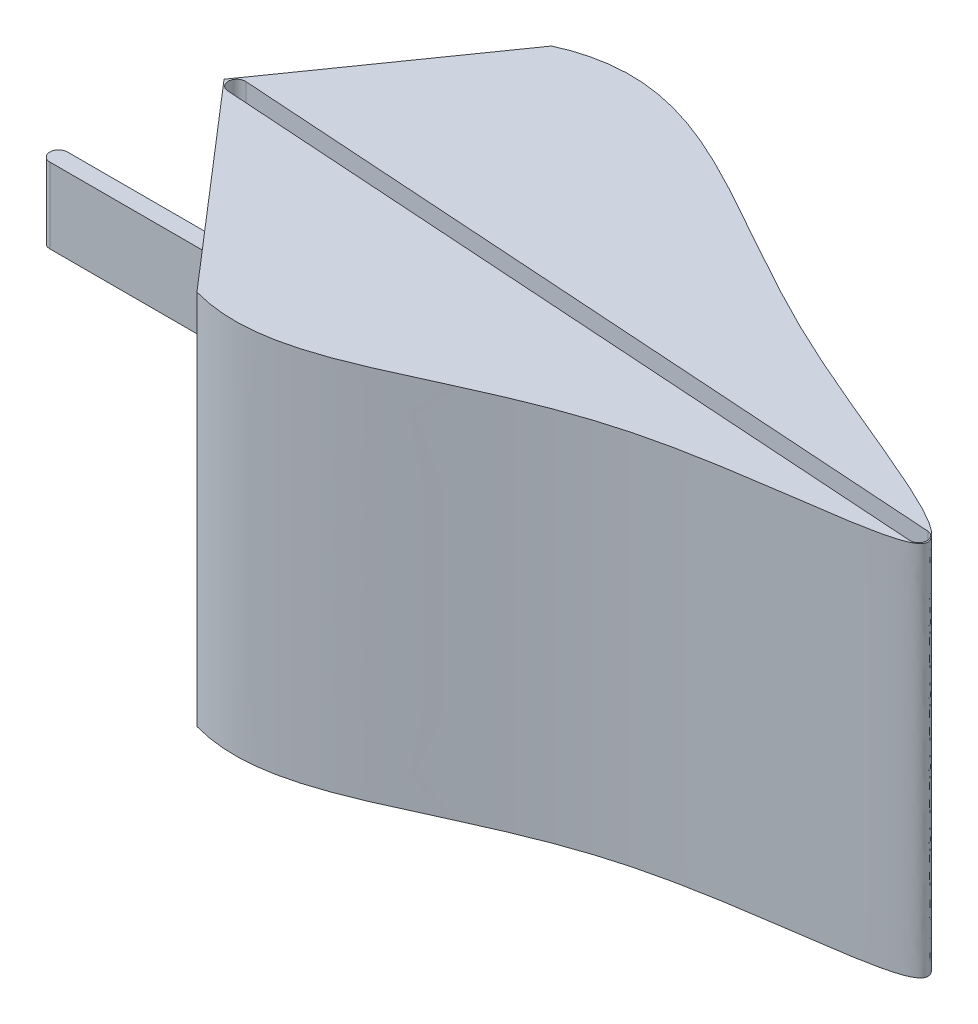
ISO-10303-21;
HEADER;
FILE_DESCRIPTION(('STEP AP214'),'2;1');
FILE_NAME('part.step','',(''),(''),'','','');
FILE_SCHEMA(('AUTOMOTIVE_DESIGN { 1 0 10303 214 1 1 1 1 }'));
ENDSEC;
DATA;
#1=APPLICATION_CONTEXT('core data for automotive mechanical design processes');
#2=APPLICATION_PROTOCOL_DEFINITION('international standard','automotive_design',2000,#1);
#3=PRODUCT_CONTEXT('',#1,'mechanical');
#4=PRODUCT('Part','Part','',(#3));
#5=PRODUCT_RELATED_PRODUCT_CATEGORY('part','',(#4));
#6=PRODUCT_DEFINITION_FORMATION('','',#4);
#7=PRODUCT_DEFINITION_CONTEXT('part definition',#1,'design');
#8=PRODUCT_DEFINITION('design','',#6,#7);
#9=PRODUCT_DEFINITION_SHAPE('','',#8);
#10=(LENGTH_UNIT() NAMED_UNIT(*) SI_UNIT(.MILLI.,.METRE.));
#11=(NAMED_UNIT(*) PLANE_ANGLE_UNIT() SI_UNIT($,.RADIAN.));
#12=(NAMED_UNIT(*) SI_UNIT($,.STERADIAN.) SOLID_ANGLE_UNIT());
#13=UNCERTAINTY_MEASURE_WITH_UNIT(LENGTH_MEASURE(1.E-05),#10,'distance_accuracy_value','');
#14=(GEOMETRIC_REPRESENTATION_CONTEXT(3) GLOBAL_UNCERTAINTY_ASSIGNED_CONTEXT((#13)) GLOBAL_UNIT_ASSIGNED_CONTEXT((#10,
#11,#12)) REPRESENTATION_CONTEXT('',''));
#15=CARTESIAN_POINT('',(0.,0.,0.));
#16=DIRECTION('',(0.,0.,1.));
#17=DIRECTION('',(1.,0.,0.));
#18=AXIS2_PLACEMENT_3D('',#15,#16,#17);
#19=CARTESIAN_POINT('',(-1.70762932432973,5.,-1.1973974284757));
#20=DIRECTION('',(0.818768320712917,0.,0.574124060632325));
#21=DIRECTION('',(0.574124060632325,0.,-0.818768320712917));
#22=AXIS2_PLACEMENT_3D('',#19,#20,#21);
#23=PLANE('',#22);
#24=DIRECTION('',(-0.574124060632325,0.,0.818768320712917));
#25=VECTOR('',#24,1.);
#26=CARTESIAN_POINT('',(-1.70762932432973,2.,-1.1973974284757));
#27=LINE('',#26,#25);
#28=CARTESIAN_POINT('',(-2.9660266568039,2.,0.597224921203759));
#29=VERTEX_POINT('',#28);
#30=CARTESIAN_POINT('',(-3.05038548425136,2.,0.717530514058368));
#31=VERTEX_POINT('',#30);
#32=EDGE_CURVE('E62',#29,#31,#27,.T.);
#33=ORIENTED_EDGE('',*,*,#32,.F.);
#34=DIRECTION('',(0.,1.,0.));
#35=VECTOR('',#34,1.);
#36=CARTESIAN_POINT('',(-2.9660266568039,2.,0.597224921203759));
#37=LINE('',#36,#35);
#38=CARTESIAN_POINT('',(-2.9660266568039,3.,0.597224921203758));
#39=VERTEX_POINT('',#38);
#40=EDGE_CURVE('E66',#29,#39,#37,.T.);
#41=ORIENTED_EDGE('',*,*,#40,.T.);
#42=DIRECTION('',(-0.574124060632325,0.,0.818768320712917));
#43=VECTOR('',#42,1.);
#44=CARTESIAN_POINT('',(-1.70762932432973,3.,-1.1973974284757));
#45=LINE('',#44,#43);
#46=CARTESIAN_POINT('',(-3.05038548425136,3.,0.717530514058368));
#47=VERTEX_POINT('',#46);
#48=EDGE_CURVE('E155',#39,#47,#45,.T.);
#49=ORIENTED_EDGE('',*,*,#48,.T.);
#50=DIRECTION('',(0.,-1.,0.));
#51=VECTOR('',#50,1.);
#52=CARTESIAN_POINT('',(-3.05038548425136,5.,0.717530514058368));
#53=LINE('',#52,#51);
#54=CARTESIAN_POINT('',(-3.05038548425136,5.,0.717530514058368));
#55=VERTEX_POINT('',#54);
#56=EDGE_CURVE('E294',#55,#47,#53,.T.);
#57=ORIENTED_EDGE('',*,*,#56,.F.);
#58=DIRECTION('',(-0.574124060632325,0.,0.818768320712917));
#59=VECTOR('',#58,1.);
#60=CARTESIAN_POINT('',(-1.70762932432973,5.,-1.1973974284757));
#61=LINE('',#60,#59);
#62=CARTESIAN_POINT('',(-1.25603944900907,5.,-1.84141761369493));
#63=VERTEX_POINT('',#62);
#64=EDGE_CURVE('E264',#63,#55,#61,.T.);
#65=ORIENTED_EDGE('',*,*,#64,.F.);
#66=DIRECTION('',(0.,-1.,0.));
#67=VECTOR('',#66,1.);
#68=CARTESIAN_POINT('',(-1.25603944900907,5.,-1.84141761369493));
#69=LINE('',#68,#67);
#70=CARTESIAN_POINT('',(-1.25603944900907,0.,-1.84141761369493));
#71=VERTEX_POINT('',#70);
#72=EDGE_CURVE('E297',#63,#71,#69,.T.);
#73=ORIENTED_EDGE('',*,*,#72,.T.);
#74=DIRECTION('',(-0.574124060632325,0.,0.818768320712917));
#75=VECTOR('',#74,1.);
#76=CARTESIAN_POINT('',(-1.70762932432973,0.,-1.1973974284757));
#77=LINE('',#76,#75);
#78=CARTESIAN_POINT('',(-3.05038548425136,0.,0.717530514058368));
#79=VERTEX_POINT('',#78);
#80=EDGE_CURVE('E281',#71,#79,#77,.T.);
#81=ORIENTED_EDGE('',*,*,#80,.T.);
#82=EDGE_CURVE('E293',#31,#79,#53,.T.);
#83=ORIENTED_EDGE('',*,*,#82,.F.);
#84=EDGE_LOOP('',(#33,#41,#49,#57,#65,#73,#81,#83));
#85=FACE_BOUND('',#84,.T.);
#86=ADVANCED_FACE('F45',(#85),#23,.F.);
#87=CARTESIAN_POINT('',(-2.10344880235215,5.,1.81497449305794));
#88=DIRECTION('',(-0.757115007215496,0.,0.653281612973364));
#89=DIRECTION('',(0.653281612973364,0.,0.757115007215496));
#90=AXIS2_PLACEMENT_3D('',#87,#88,#89);
#91=PLANE('',#90);
#92=DIRECTION('',(0.,1.,0.));
#93=VECTOR('',#92,1.);
#94=CARTESIAN_POINT('',(-2.95774852078591,2.,0.824891312020131));
#95=LINE('',#94,#93);
#96=CARTESIAN_POINT('',(-2.95774852078591,2.,0.824891312020131));
#97=VERTEX_POINT('',#96);
#98=CARTESIAN_POINT('',(-2.95774852078591,3.,0.824891312020131));
#99=VERTEX_POINT('',#98);
#100=EDGE_CURVE('E55',#97,#99,#95,.T.);
#101=ORIENTED_EDGE('',*,*,#100,.F.);
#102=DIRECTION('',(-0.653281612973364,0.,-0.757115007215496));
#103=VECTOR('',#102,1.);
#104=CARTESIAN_POINT('',(-2.10344880235215,2.,1.81497449305794));
#105=LINE('',#104,#103);
#106=EDGE_CURVE('E11',#97,#31,#105,.T.);
#107=ORIENTED_EDGE('',*,*,#106,.T.);
#108=ORIENTED_EDGE('',*,*,#82,.T.);
#109=DIRECTION('',(-0.653281612973364,0.,-0.757115007215496));
#110=VECTOR('',#109,1.);
#111=CARTESIAN_POINT('',(-2.10344880235215,0.,1.81497449305794));
#112=LINE('',#111,#110);
#113=CARTESIAN_POINT('',(-0.780587172944463,0.,3.34809339952092));
#114=VERTEX_POINT('',#113);
#115=EDGE_CURVE('E265',#114,#79,#112,.T.);
#116=ORIENTED_EDGE('',*,*,#115,.F.);
#117=DIRECTION('',(0.,-1.,0.));
#118=VECTOR('',#117,1.);
#119=CARTESIAN_POINT('',(-0.780587172944463,5.,3.34809339952092));
#120=LINE('',#119,#118);
#121=CARTESIAN_POINT('',(-0.780587172944463,5.,3.34809339952092));
#122=VERTEX_POINT('',#121);
#123=EDGE_CURVE('E275',#122,#114,#120,.T.);
#124=ORIENTED_EDGE('',*,*,#123,.F.);
#125=DIRECTION('',(-0.653281612973364,0.,-0.757115007215496));
#126=VECTOR('',#125,1.);
#127=CARTESIAN_POINT('',(-2.10344880235215,5.,1.81497449305794));
#128=LINE('',#127,#126);
#129=EDGE_CURVE('E271',#122,#55,#128,.T.);
#130=ORIENTED_EDGE('',*,*,#129,.T.);
#131=ORIENTED_EDGE('',*,*,#56,.T.);
#132=DIRECTION('',(-0.653281612973364,0.,-0.757115007215496));
#133=VECTOR('',#132,1.);
#134=CARTESIAN_POINT('',(-2.10344880235215,3.,1.81497449305794));
#135=LINE('',#134,#133);
#136=EDGE_CURVE('E300',#99,#47,#135,.T.);
#137=ORIENTED_EDGE('',*,*,#136,.F.);
#138=EDGE_LOOP('',(#101,#107,#108,#116,#124,#130,#131,#137));
#139=FACE_BOUND('',#138,.T.);
#140=ADVANCED_FACE('F317',(#139),#91,.T.);
#141=CARTESIAN_POINT('',(-3.05038548425136,5.,0.717530514058367));
#142=CARTESIAN_POINT('',(-3.07042978102789,5.,-0.348101200576227));
#143=CARTESIAN_POINT('',(-0.570904340301446,5.,-3.27934040407769));
#144=CARTESIAN_POINT('',(2.51061874756297,5.,-0.367707339944473));
#145=CARTESIAN_POINT('',(8.76491562461771,5.,1.63544852523869));
#146=CARTESIAN_POINT('',(2.58465033811313,5.,1.77274229454659));
#147=CARTESIAN_POINT('',(-0.229785259933754,5.,4.59680119752773));
#148=CARTESIAN_POINT('',(-3.02810230230291,5.,1.90218995369812));
#149=CARTESIAN_POINT('',(-3.05038548425136,5.,0.717530514058367));
#150=B_SPLINE_CURVE_WITH_KNOTS('',3,(#141,#142,#143,#144,#145,#146,#147,#148,#149),
.UNSPECIFIED.,.T.,.F.,(4,1,1,1,1,1,4),(0.,0.133444496933957,0.358406605125516,0.511014145272804,
0.653251299475649,0.8516501707018,1.),.UNSPECIFIED.);
#151=DIRECTION('',(0.,-1.,0.));
#152=VECTOR('',#151,1.);
#153=SURFACE_OF_LINEAR_EXTRUSION('',#150,#152);
#154=CARTESIAN_POINT('',(-3.05038548425136,0.,0.717530514058367));
#155=CARTESIAN_POINT('',(-3.07042978102789,0.,-0.348101200576227));
#156=CARTESIAN_POINT('',(-0.570904340301446,0.,-3.27934040407769));
#157=CARTESIAN_POINT('',(2.51061874756297,0.,-0.367707339944473));
#158=CARTESIAN_POINT('',(8.76491562461771,0.,1.63544852523869));
#159=CARTESIAN_POINT('',(2.58465033811313,0.,1.77274229454659));
#160=CARTESIAN_POINT('',(-0.229785259933754,0.,4.59680119752773));
#161=CARTESIAN_POINT('',(-3.02810230230291,0.,1.90218995369812));
#162=CARTESIAN_POINT('',(-3.05038548425136,0.,0.717530514058367));
#163=B_SPLINE_CURVE_WITH_KNOTS('',3,(#154,#155,#156,#157,#158,#159,#160,#161,#162),
.UNSPECIFIED.,.T.,.F.,(4,1,1,1,1,1,4),(0.,0.133444496933957,0.358406605125516,0.511014145272804,
0.653251299475649,0.8516501707018,1.),.UNSPECIFIED.);
#164=EDGE_CURVE('E248',#71,#114,#163,.T.);
#165=ORIENTED_EDGE('',*,*,#164,.F.);
#166=ORIENTED_EDGE('',*,*,#72,.F.);
#167=EDGE_CURVE('E257',#63,#122,#150,.T.);
#168=ORIENTED_EDGE('',*,*,#167,.T.);
#169=ORIENTED_EDGE('',*,*,#123,.T.);
#170=EDGE_LOOP('',(#165,#166,#168,#169));
#171=FACE_BOUND('',#170,.T.);
#172=ADVANCED_FACE('F47',(#171),#153,.T.);
#173=CARTESIAN_POINT('',(0.,5.,0.));
#174=DIRECTION('',(0.,1.,0.));
#175=DIRECTION('',(0.,0.,1.));
#176=AXIS2_PLACEMENT_3D('',#173,#174,#175);
#177=PLANE('',#176);
#178=CARTESIAN_POINT('',(-2.88540033392337,5.,0.713066641255367));
#179=DIRECTION('',(0.,1.,0.));
#180=DIRECTION('',(0.,0.,1.));
#181=AXIS2_PLACEMENT_3D('',#178,#179,#180);
#182=CIRCLE('',#181,0.11394124930811);
#183=CARTESIAN_POINT('',(-2.87787149697776,5.,0.599374403577769));
#184=VERTEX_POINT('',#183);
#185=CARTESIAN_POINT('',(-2.89292917086898,5.,0.826758878932964));
#186=VERTEX_POINT('',#185);
#187=EDGE_CURVE('E213',#184,#186,#182,.T.);
#188=ORIENTED_EDGE('',*,*,#187,.F.);
#189=DIRECTION('',(-0.997814561170563,0.,-0.066076482321608));
#190=VECTOR('',#189,1.);
#191=CARTESIAN_POINT('',(-2.87787149697776,5.,0.599374403577769));
#192=LINE('',#191,#190);
#193=CARTESIAN_POINT('',(6.82681995873197,5.,1.24203076314983));
#194=VERTEX_POINT('',#193);
#195=EDGE_CURVE('E219',#194,#184,#192,.T.);
#196=ORIENTED_EDGE('',*,*,#195,.F.);
#197=CARTESIAN_POINT('',(6.81929112178636,5.,1.35572300082742));
#198=DIRECTION('',(0.,1.,0.));
#199=DIRECTION('',(0.,0.,1.));
#200=AXIS2_PLACEMENT_3D('',#197,#198,#199);
#201=CIRCLE('',#200,0.11394124930811);
#202=CARTESIAN_POINT('',(6.81176228484075,5.,1.46941523850502));
#203=VERTEX_POINT('',#202);
#204=EDGE_CURVE('E238',#203,#194,#201,.T.);
#205=ORIENTED_EDGE('',*,*,#204,.F.);
#206=DIRECTION('',(0.997814561170563,0.,0.066076482321608));
#207=VECTOR('',#206,1.);
#208=CARTESIAN_POINT('',(-2.89292917086898,5.,0.826758878932964));
#209=LINE('',#208,#207);
#210=EDGE_CURVE('E234',#186,#203,#209,.T.);
#211=ORIENTED_EDGE('',*,*,#210,.F.);
#212=EDGE_LOOP('',(#188,#196,#205,#211));
#213=FACE_BOUND('',#212,.T.);
#214=ORIENTED_EDGE('',*,*,#167,.F.);
#215=ORIENTED_EDGE('',*,*,#64,.T.);
#216=ORIENTED_EDGE('',*,*,#129,.F.);
#217=EDGE_LOOP('',(#214,#215,#216));
#218=FACE_BOUND('',#217,.T.);
#219=ADVANCED_FACE('F330',(#213,#218),#177,.T.);
#220=CARTESIAN_POINT('',(0.,0.,0.));
#221=DIRECTION('',(0.,1.,0.));
#222=DIRECTION('',(0.,0.,1.));
#223=AXIS2_PLACEMENT_3D('',#220,#221,#222);
#224=PLANE('',#223);
#225=ORIENTED_EDGE('',*,*,#164,.T.);
#226=ORIENTED_EDGE('',*,*,#115,.T.);
#227=ORIENTED_EDGE('',*,*,#80,.F.);
#228=EDGE_LOOP('',(#225,#226,#227));
#229=FACE_BOUND('',#228,.T.);
#230=ADVANCED_FACE('F325',(#229),#224,.F.);
#231=CARTESIAN_POINT('',(-2.88540033392337,4.,0.713066641255367));
#232=DIRECTION('',(0.,1.,0.));
#233=DIRECTION('',(0.,0.,1.));
#234=AXIS2_PLACEMENT_3D('',#231,#232,#233);
#235=CYLINDRICAL_SURFACE('',#234,0.11394124930811);
#236=ORIENTED_EDGE('',*,*,#187,.T.);
#237=DIRECTION('',(0.,1.,0.));
#238=VECTOR('',#237,1.);
#239=CARTESIAN_POINT('',(-2.89292917086898,4.,0.826758878932964));
#240=LINE('',#239,#238);
#241=CARTESIAN_POINT('',(-2.89292917086898,4.,0.826758878932964));
#242=VERTEX_POINT('',#241);
#243=EDGE_CURVE('E231',#242,#186,#240,.T.);
#244=ORIENTED_EDGE('',*,*,#243,.F.);
#245=CARTESIAN_POINT('',(-2.88540033392337,4.,0.713066641255367));
#246=DIRECTION('',(0.,1.,0.));
#247=DIRECTION('',(0.,0.,1.));
#248=AXIS2_PLACEMENT_3D('',#245,#246,#247);
#249=CIRCLE('',#248,0.11394124930811);
#250=CARTESIAN_POINT('',(-2.87787149697776,4.,0.599374403577769));
#251=VERTEX_POINT('',#250);
#252=EDGE_CURVE('E214',#251,#242,#249,.T.);
#253=ORIENTED_EDGE('',*,*,#252,.F.);
#254=DIRECTION('',(0.,1.,0.));
#255=VECTOR('',#254,1.);
#256=CARTESIAN_POINT('',(-2.87787149697776,4.,0.599374403577769));
#257=LINE('',#256,#255);
#258=EDGE_CURVE('E245',#251,#184,#257,.T.);
#259=ORIENTED_EDGE('',*,*,#258,.T.);
#260=EDGE_LOOP('',(#236,#244,#253,#259));
#261=FACE_BOUND('',#260,.T.);
#262=ADVANCED_FACE('F340',(#261),#235,.F.);
#263=CARTESIAN_POINT('',(-2.87787149697776,4.,0.599374403577769));
#264=DIRECTION('',(0.066076482321608,0.,-0.997814561170563));
#265=DIRECTION('',(-0.997814561170563,0.,-0.066076482321608));
#266=AXIS2_PLACEMENT_3D('',#263,#264,#265);
#267=PLANE('',#266);
#268=ORIENTED_EDGE('',*,*,#195,.T.);
#269=ORIENTED_EDGE('',*,*,#258,.F.);
#270=DIRECTION('',(-0.997814561170563,0.,-0.066076482321608));
#271=VECTOR('',#270,1.);
#272=CARTESIAN_POINT('',(-2.87787149697776,4.,0.599374403577769));
#273=LINE('',#272,#271);
#274=CARTESIAN_POINT('',(6.82681995873197,4.,1.24203076314983));
#275=VERTEX_POINT('',#274);
#276=EDGE_CURVE('E227',#275,#251,#273,.T.);
#277=ORIENTED_EDGE('',*,*,#276,.F.);
#278=DIRECTION('',(0.,1.,0.));
#279=VECTOR('',#278,1.);
#280=CARTESIAN_POINT('',(6.82681995873197,4.,1.24203076314983));
#281=LINE('',#280,#279);
#282=EDGE_CURVE('E249',#275,#194,#281,.T.);
#283=ORIENTED_EDGE('',*,*,#282,.T.);
#284=EDGE_LOOP('',(#268,#269,#277,#283));
#285=FACE_BOUND('',#284,.T.);
#286=ADVANCED_FACE('F420',(#285),#267,.F.);
#287=CARTESIAN_POINT('',(6.81929112178636,4.,1.35572300082742));
#288=DIRECTION('',(0.,1.,0.));
#289=DIRECTION('',(0.,0.,1.));
#290=AXIS2_PLACEMENT_3D('',#287,#288,#289);
#291=CYLINDRICAL_SURFACE('',#290,0.11394124930811);
#292=ORIENTED_EDGE('',*,*,#204,.T.);
#293=ORIENTED_EDGE('',*,*,#282,.F.);
#294=CARTESIAN_POINT('',(6.81929112178636,4.,1.35572300082742));
#295=DIRECTION('',(0.,1.,0.));
#296=DIRECTION('',(0.,0.,1.));
#297=AXIS2_PLACEMENT_3D('',#294,#295,#296);
#298=CIRCLE('',#297,0.11394124930811);
#299=CARTESIAN_POINT('',(6.81176228484075,4.,1.46941523850502));
#300=VERTEX_POINT('',#299);
#301=EDGE_CURVE('E223',#300,#275,#298,.T.);
#302=ORIENTED_EDGE('',*,*,#301,.F.);
#303=DIRECTION('',(0.,1.,0.));
#304=VECTOR('',#303,1.);
#305=CARTESIAN_POINT('',(6.81176228484075,4.,1.46941523850502));
#306=LINE('',#305,#304);
#307=EDGE_CURVE('E252',#300,#203,#306,.T.);
#308=ORIENTED_EDGE('',*,*,#307,.T.);
#309=EDGE_LOOP('',(#292,#293,#302,#308));
#310=FACE_BOUND('',#309,.T.);
#311=ADVANCED_FACE('F423',(#310),#291,.F.);
#312=CARTESIAN_POINT('',(-2.89292917086898,4.,0.826758878932964));
#313=DIRECTION('',(-0.066076482321608,0.,0.997814561170563));
#314=DIRECTION('',(0.997814561170563,0.,0.066076482321608));
#315=AXIS2_PLACEMENT_3D('',#312,#313,#314);
#316=PLANE('',#315);
#317=ORIENTED_EDGE('',*,*,#210,.T.);
#318=ORIENTED_EDGE('',*,*,#307,.F.);
#319=DIRECTION('',(0.997814561170563,0.,0.066076482321608));
#320=VECTOR('',#319,1.);
#321=CARTESIAN_POINT('',(-2.89292917086898,4.,0.826758878932964));
#322=LINE('',#321,#320);
#323=EDGE_CURVE('E218',#242,#300,#322,.T.);
#324=ORIENTED_EDGE('',*,*,#323,.F.);
#325=ORIENTED_EDGE('',*,*,#243,.T.);
#326=EDGE_LOOP('',(#317,#318,#324,#325));
#327=FACE_BOUND('',#326,.T.);
#328=ADVANCED_FACE('F418',(#327),#316,.F.);
#329=CARTESIAN_POINT('',(-2.88540033392337,4.,0.713066641255367));
#330=DIRECTION('',(0.,1.,0.));
#331=DIRECTION('',(0.,0.,1.));
#332=AXIS2_PLACEMENT_3D('',#329,#330,#331);
#333=PLANE('',#332);
#334=ORIENTED_EDGE('',*,*,#252,.T.);
#335=ORIENTED_EDGE('',*,*,#323,.T.);
#336=ORIENTED_EDGE('',*,*,#301,.T.);
#337=ORIENTED_EDGE('',*,*,#276,.T.);
#338=EDGE_LOOP('',(#334,#335,#336,#337));
#339=FACE_BOUND('',#338,.T.);
#340=ADVANCED_FACE('F362',(#339),#333,.T.);
#341=CARTESIAN_POINT('',(-2.98581680207407,2.,0.711928202361616));
#342=DIRECTION('',(0.,1.,0.));
#343=DIRECTION('',(0.,0.,1.));
#344=AXIS2_PLACEMENT_3D('',#341,#342,#343);
#345=CYLINDRICAL_SURFACE('',#344,0.116397992071138);
#346=ORIENTED_EDGE('',*,*,#40,.F.);
#347=CARTESIAN_POINT('',(-2.98581680207407,2.,0.711928202361616));
#348=DIRECTION('',(0.,1.,0.));
#349=DIRECTION('',(0.,0.,1.));
#350=AXIS2_PLACEMENT_3D('',#347,#348,#349);
#351=CIRCLE('',#350,0.116397992071138);
#352=CARTESIAN_POINT('',(-2.98581680207407,2.,0.595530210290478));
#353=VERTEX_POINT('',#352);
#354=EDGE_CURVE('E164',#29,#353,#351,.T.);
#355=ORIENTED_EDGE('',*,*,#354,.T.);
#356=DIRECTION('',(0.,1.,0.));
#357=VECTOR('',#356,1.);
#358=CARTESIAN_POINT('',(-2.98581680207407,2.,0.595530210290478));
#359=LINE('',#358,#357);
#360=CARTESIAN_POINT('',(-2.98581680207407,3.,0.595530210290478));
#361=VERTEX_POINT('',#360);
#362=EDGE_CURVE('E161',#353,#361,#359,.T.);
#363=ORIENTED_EDGE('',*,*,#362,.T.);
#364=CARTESIAN_POINT('',(-2.98581680207407,3.,0.711928202361616));
#365=DIRECTION('',(0.,1.,0.));
#366=DIRECTION('',(0.,0.,1.));
#367=AXIS2_PLACEMENT_3D('',#364,#365,#366);
#368=CIRCLE('',#367,0.116397992071138);
#369=EDGE_CURVE('E147',#39,#361,#368,.T.);
#370=ORIENTED_EDGE('',*,*,#369,.F.);
#371=EDGE_LOOP('',(#346,#355,#363,#370));
#372=FACE_BOUND('',#371,.T.);
#373=ADVANCED_FACE('F162',(#372),#345,.T.);
#374=CARTESIAN_POINT('',(-2.98581680207407,2.,0.711928202361616));
#375=DIRECTION('',(0.,1.,0.));
#376=DIRECTION('',(0.,0.,1.));
#377=AXIS2_PLACEMENT_3D('',#374,#375,#376);
#378=PLANE('',#377);
#379=ORIENTED_EDGE('',*,*,#354,.F.);
#380=ORIENTED_EDGE('',*,*,#32,.T.);
#381=ORIENTED_EDGE('',*,*,#106,.F.);
#382=CARTESIAN_POINT('',(-2.98581680207407,2.,0.828326194432754));
#383=VERTEX_POINT('',#382);
#384=EDGE_CURVE('E185',#383,#97,#351,.T.);
#385=ORIENTED_EDGE('',*,*,#384,.F.);
#386=DIRECTION('',(1.,0.,0.));
#387=VECTOR('',#386,1.);
#388=CARTESIAN_POINT('',(-2.98581680207407,2.,0.828326194432754));
#389=LINE('',#388,#387);
#390=CARTESIAN_POINT('',(-5.25428433643824,2.,0.828326194432754));
#391=VERTEX_POINT('',#390);
#392=EDGE_CURVE('E170',#391,#383,#389,.T.);
#393=ORIENTED_EDGE('',*,*,#392,.F.);
#394=CARTESIAN_POINT('',(-5.25428433643824,2.,0.711928202361616));
#395=DIRECTION('',(0.,1.,0.));
#396=DIRECTION('',(0.,0.,1.));
#397=AXIS2_PLACEMENT_3D('',#394,#395,#396);
#398=CIRCLE('',#397,0.116397992071138);
#399=CARTESIAN_POINT('',(-5.25428433643824,2.,0.595530210290478));
#400=VERTEX_POINT('',#399);
#401=EDGE_CURVE('E192',#400,#391,#398,.T.);
#402=ORIENTED_EDGE('',*,*,#401,.F.);
#403=DIRECTION('',(-1.,0.,0.));
#404=VECTOR('',#403,1.);
#405=CARTESIAN_POINT('',(-2.98581680207407,2.,0.595530210290478));
#406=LINE('',#405,#404);
#407=EDGE_CURVE('E189',#353,#400,#406,.T.);
#408=ORIENTED_EDGE('',*,*,#407,.F.);
#409=EDGE_LOOP('',(#379,#380,#381,#385,#393,#402,#408));
#410=FACE_BOUND('',#409,.T.);
#411=ADVANCED_FACE('F315',(#410),#378,.F.);
#412=CARTESIAN_POINT('',(-2.98581680207407,3.,0.711928202361616));
#413=DIRECTION('',(0.,1.,0.));
#414=DIRECTION('',(0.,0.,1.));
#415=AXIS2_PLACEMENT_3D('',#412,#413,#414);
#416=PLANE('',#415);
#417=ORIENTED_EDGE('',*,*,#48,.F.);
#418=ORIENTED_EDGE('',*,*,#369,.T.);
#419=DIRECTION('',(-1.,0.,0.));
#420=VECTOR('',#419,1.);
#421=CARTESIAN_POINT('',(-2.98581680207407,3.,0.595530210290478));
#422=LINE('',#421,#420);
#423=CARTESIAN_POINT('',(-5.25428433643824,3.,0.595530210290478));
#424=VERTEX_POINT('',#423);
#425=EDGE_CURVE('E152',#361,#424,#422,.T.);
#426=ORIENTED_EDGE('',*,*,#425,.T.);
#427=CARTESIAN_POINT('',(-5.25428433643824,3.,0.711928202361616));
#428=DIRECTION('',(0.,1.,0.));
#429=DIRECTION('',(0.,0.,1.));
#430=AXIS2_PLACEMENT_3D('',#427,#428,#429);
#431=CIRCLE('',#430,0.116397992071138);
#432=CARTESIAN_POINT('',(-5.25428433643824,3.,0.828326194432754));
#433=VERTEX_POINT('',#432);
#434=EDGE_CURVE('E174',#424,#433,#431,.T.);
#435=ORIENTED_EDGE('',*,*,#434,.T.);
#436=DIRECTION('',(1.,0.,0.));
#437=VECTOR('',#436,1.);
#438=CARTESIAN_POINT('',(-2.98581680207407,3.,0.828326194432754));
#439=LINE('',#438,#437);
#440=CARTESIAN_POINT('',(-2.98581680207407,3.,0.828326194432754));
#441=VERTEX_POINT('',#440);
#442=EDGE_CURVE('E178',#433,#441,#439,.T.);
#443=ORIENTED_EDGE('',*,*,#442,.T.);
#444=EDGE_CURVE('E158',#441,#99,#368,.T.);
#445=ORIENTED_EDGE('',*,*,#444,.T.);
#446=ORIENTED_EDGE('',*,*,#136,.T.);
#447=EDGE_LOOP('',(#417,#418,#426,#435,#443,#445,#446));
#448=FACE_BOUND('',#447,.T.);
#449=ADVANCED_FACE('F149',(#448),#416,.T.);
#450=ORIENTED_EDGE('',*,*,#384,.T.);
#451=ORIENTED_EDGE('',*,*,#100,.T.);
#452=ORIENTED_EDGE('',*,*,#444,.F.);
#453=DIRECTION('',(0.,1.,0.));
#454=VECTOR('',#453,1.);
#455=CARTESIAN_POINT('',(-2.98581680207407,2.,0.828326194432754));
#456=LINE('',#455,#454);
#457=EDGE_CURVE('E199',#383,#441,#456,.T.);
#458=ORIENTED_EDGE('',*,*,#457,.F.);
#459=EDGE_LOOP('',(#450,#451,#452,#458));
#460=FACE_BOUND('',#459,.T.);
#461=ADVANCED_FACE('F306',(#460),#345,.T.);
#462=CARTESIAN_POINT('',(-2.98581680207407,2.,0.828326194432754));
#463=DIRECTION('',(0.,0.,1.));
#464=DIRECTION('',(1.,0.,0.));
#465=AXIS2_PLACEMENT_3D('',#462,#463,#464);
#466=PLANE('',#465);
#467=ORIENTED_EDGE('',*,*,#457,.T.);
#468=ORIENTED_EDGE('',*,*,#442,.F.);
#469=DIRECTION('',(0.,1.,0.));
#470=VECTOR('',#469,1.);
#471=CARTESIAN_POINT('',(-5.25428433643824,2.,0.828326194432754));
#472=LINE('',#471,#470);
#473=EDGE_CURVE('E202',#391,#433,#472,.T.);
#474=ORIENTED_EDGE('',*,*,#473,.F.);
#475=ORIENTED_EDGE('',*,*,#392,.T.);
#476=EDGE_LOOP('',(#467,#468,#474,#475));
#477=FACE_BOUND('',#476,.T.);
#478=ADVANCED_FACE('F312',(#477),#466,.T.);
#479=CARTESIAN_POINT('',(-5.25428433643824,2.,0.711928202361616));
#480=DIRECTION('',(0.,1.,0.));
#481=DIRECTION('',(0.,0.,1.));
#482=AXIS2_PLACEMENT_3D('',#479,#480,#481);
#483=CYLINDRICAL_SURFACE('',#482,0.116397992071138);
#484=ORIENTED_EDGE('',*,*,#473,.T.);
#485=ORIENTED_EDGE('',*,*,#434,.F.);
#486=DIRECTION('',(0.,1.,0.));
#487=VECTOR('',#486,1.);
#488=CARTESIAN_POINT('',(-5.25428433643824,2.,0.595530210290478));
#489=LINE('',#488,#487);
#490=EDGE_CURVE('E169',#400,#424,#489,.T.);
#491=ORIENTED_EDGE('',*,*,#490,.F.);
#492=ORIENTED_EDGE('',*,*,#401,.T.);
#493=EDGE_LOOP('',(#484,#485,#491,#492));
#494=FACE_BOUND('',#493,.T.);
#495=ADVANCED_FACE('F395',(#494),#483,.T.);
#496=CARTESIAN_POINT('',(-2.98581680207407,2.,0.595530210290478));
#497=DIRECTION('',(0.,0.,-1.));
#498=DIRECTION('',(-1.,0.,0.));
#499=AXIS2_PLACEMENT_3D('',#496,#497,#498);
#500=PLANE('',#499);
#501=ORIENTED_EDGE('',*,*,#490,.T.);
#502=ORIENTED_EDGE('',*,*,#425,.F.);
#503=ORIENTED_EDGE('',*,*,#362,.F.);
#504=ORIENTED_EDGE('',*,*,#407,.T.);
#505=EDGE_LOOP('',(#501,#502,#503,#504));
#506=FACE_BOUND('',#505,.T.);
#507=ADVANCED_FACE('F172',(#506),#500,.T.);
#508=CLOSED_SHELL('',(#86,#140,#172,#219,#230,#262,#286,#311,#328,#340,#373,#411,#449,#461,#478,
#495,#507));
#509=MANIFOLD_SOLID_BREP('B2',#508);
#510=ADVANCED_BREP_SHAPE_REPRESENTATION('',(#18,#509),#14);
#511=SHAPE_DEFINITION_REPRESENTATION(#9,#510);
ENDSEC;
END-ISO-10303-21;
